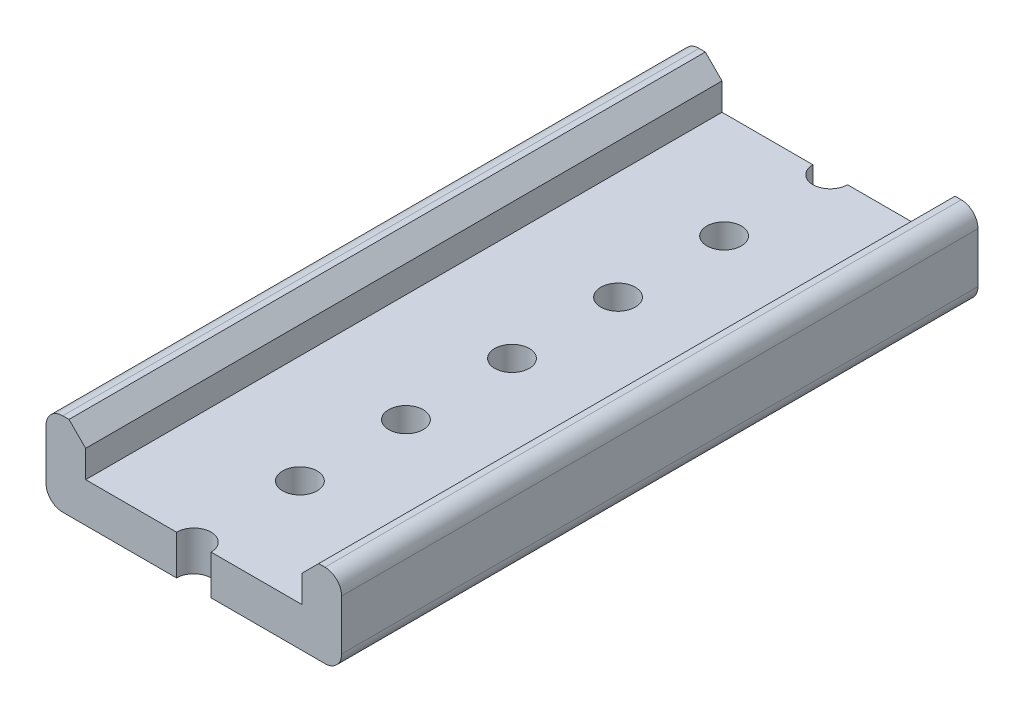
ISO-10303-21;
HEADER;
FILE_DESCRIPTION(('STEP AP214'),'2;1');
FILE_NAME('part.step','',(''),(''),'','','');
FILE_SCHEMA(('AUTOMOTIVE_DESIGN { 1 0 10303 214 1 1 1 1 }'));
ENDSEC;
DATA;
#1=APPLICATION_CONTEXT('core data for automotive mechanical design processes');
#2=APPLICATION_PROTOCOL_DEFINITION('international standard','automotive_design',2000,#1);
#3=PRODUCT_CONTEXT('',#1,'mechanical');
#4=PRODUCT('Part','Part','',(#3));
#5=PRODUCT_RELATED_PRODUCT_CATEGORY('part','',(#4));
#6=PRODUCT_DEFINITION_FORMATION('','',#4);
#7=PRODUCT_DEFINITION_CONTEXT('part definition',#1,'design');
#8=PRODUCT_DEFINITION('design','',#6,#7);
#9=PRODUCT_DEFINITION_SHAPE('','',#8);
#10=(LENGTH_UNIT() NAMED_UNIT(*) SI_UNIT(.MILLI.,.METRE.));
#11=(NAMED_UNIT(*) PLANE_ANGLE_UNIT() SI_UNIT($,.RADIAN.));
#12=(NAMED_UNIT(*) SI_UNIT($,.STERADIAN.) SOLID_ANGLE_UNIT());
#13=UNCERTAINTY_MEASURE_WITH_UNIT(LENGTH_MEASURE(1.E-05),#10,'distance_accuracy_value','');
#14=(GEOMETRIC_REPRESENTATION_CONTEXT(3) GLOBAL_UNCERTAINTY_ASSIGNED_CONTEXT((#13)) GLOBAL_UNIT_ASSIGNED_CONTEXT((#10,
#11,#12)) REPRESENTATION_CONTEXT('',''));
#15=CARTESIAN_POINT('',(0.,0.,0.));
#16=DIRECTION('',(0.,0.,1.));
#17=DIRECTION('',(1.,0.,0.));
#18=AXIS2_PLACEMENT_3D('',#15,#16,#17);
#19=CARTESIAN_POINT('',(0.,0.,38.1));
#20=DIRECTION('',(0.,0.,-1.));
#21=DIRECTION('',(-1.,0.,0.));
#22=AXIS2_PLACEMENT_3D('',#19,#20,#21);
#23=PLANE('',#22);
#24=DIRECTION('',(0.,-1.,0.));
#25=VECTOR('',#24,1.);
#26=CARTESIAN_POINT('',(-17.7,-7.7,38.1));
#27=LINE('',#26,#25);
#28=CARTESIAN_POINT('',(-17.7,-9.7,38.1));
#29=VERTEX_POINT('',#28);
#30=CARTESIAN_POINT('',(-17.7,-15.7,38.1));
#31=VERTEX_POINT('',#30);
#32=EDGE_CURVE('E202',#29,#31,#27,.T.);
#33=ORIENTED_EDGE('',*,*,#32,.T.);
#34=CARTESIAN_POINT('',(-15.7,-15.7,38.1));
#35=DIRECTION('',(0.,0.,-1.));
#36=DIRECTION('',(-1.,0.,0.));
#37=AXIS2_PLACEMENT_3D('',#34,#35,#36);
#38=CIRCLE('',#37,2.);
#39=CARTESIAN_POINT('',(-15.7,-17.7,38.1));
#40=VERTEX_POINT('',#39);
#41=EDGE_CURVE('E291',#31,#40,#38,.F.);
#42=ORIENTED_EDGE('',*,*,#41,.T.);
#43=DIRECTION('',(1.,0.,0.));
#44=VECTOR('',#43,1.);
#45=CARTESIAN_POINT('',(-17.7,-17.7,38.1));
#46=LINE('',#45,#44);
#47=CARTESIAN_POINT('',(-2.06999999999934,-17.7,38.1));
#48=VERTEX_POINT('',#47);
#49=EDGE_CURVE('E295',#40,#48,#46,.T.);
#50=ORIENTED_EDGE('',*,*,#49,.T.);
#51=DIRECTION('',(0.,1.,0.));
#52=VECTOR('',#51,1.);
#53=CARTESIAN_POINT('',(-2.06999999999934,-17.7,38.1));
#54=LINE('',#53,#52);
#55=CARTESIAN_POINT('',(-2.06999999999934,-12.95,38.1));
#56=VERTEX_POINT('',#55);
#57=EDGE_CURVE('E230',#48,#56,#54,.T.);
#58=ORIENTED_EDGE('',*,*,#57,.T.);
#59=DIRECTION('',(-1.,0.,0.));
#60=VECTOR('',#59,1.);
#61=CARTESIAN_POINT('',(-12.95,-12.95,38.1));
#62=LINE('',#61,#60);
#63=CARTESIAN_POINT('',(-12.95,-12.95,38.1));
#64=VERTEX_POINT('',#63);
#65=EDGE_CURVE('E332',#56,#64,#62,.T.);
#66=ORIENTED_EDGE('',*,*,#65,.T.);
#67=DIRECTION('',(0.,1.,0.));
#68=VECTOR('',#67,1.);
#69=CARTESIAN_POINT('',(-12.95,-7.7,38.1));
#70=LINE('',#69,#68);
#71=CARTESIAN_POINT('',(-12.95,-9.7,38.1));
#72=VERTEX_POINT('',#71);
#73=EDGE_CURVE('E327',#64,#72,#70,.T.);
#74=ORIENTED_EDGE('',*,*,#73,.T.);
#75=DIRECTION('',(0.707106781186545,-0.70710678118655,0.));
#76=VECTOR('',#75,1.);
#77=CARTESIAN_POINT('',(-14.95,-7.7,38.1));
#78=LINE('',#77,#76);
#79=CARTESIAN_POINT('',(-14.95,-7.7,38.1));
#80=VERTEX_POINT('',#79);
#81=EDGE_CURVE('E263',#72,#80,#78,.F.);
#82=ORIENTED_EDGE('',*,*,#81,.T.);
#83=DIRECTION('',(-1.,0.,0.));
#84=VECTOR('',#83,1.);
#85=CARTESIAN_POINT('',(-17.7,-7.7,38.1));
#86=LINE('',#85,#84);
#87=CARTESIAN_POINT('',(-15.7,-7.7,38.1));
#88=VERTEX_POINT('',#87);
#89=EDGE_CURVE('E315',#80,#88,#86,.T.);
#90=ORIENTED_EDGE('',*,*,#89,.T.);
#91=CARTESIAN_POINT('',(-15.7,-9.7,38.1));
#92=DIRECTION('',(0.,0.,-1.));
#93=DIRECTION('',(-1.,0.,0.));
#94=AXIS2_PLACEMENT_3D('',#91,#92,#93);
#95=CIRCLE('',#94,2.);
#96=EDGE_CURVE('E289',#88,#29,#95,.F.);
#97=ORIENTED_EDGE('',*,*,#96,.T.);
#98=EDGE_LOOP('',(#33,#42,#50,#58,#66,#74,#82,#90,#97));
#99=FACE_BOUND('',#98,.T.);
#100=ADVANCED_FACE('F39',(#99),#23,.F.);
#101=CARTESIAN_POINT('',(0.,0.,-38.1));
#102=DIRECTION('',(0.,0.,-1.));
#103=DIRECTION('',(-1.,0.,0.));
#104=AXIS2_PLACEMENT_3D('',#101,#102,#103);
#105=PLANE('',#104);
#106=DIRECTION('',(1.,0.,0.));
#107=VECTOR('',#106,1.);
#108=CARTESIAN_POINT('',(-17.7,-17.7,-38.1));
#109=LINE('',#108,#107);
#110=CARTESIAN_POINT('',(-15.7,-17.7,-38.1));
#111=VERTEX_POINT('',#110);
#112=CARTESIAN_POINT('',(-2.07000000000004,-17.7,-38.1));
#113=VERTEX_POINT('',#112);
#114=EDGE_CURVE('E188',#111,#113,#109,.T.);
#115=ORIENTED_EDGE('',*,*,#114,.F.);
#116=CARTESIAN_POINT('',(-15.7,-15.7,-38.1));
#117=DIRECTION('',(0.,0.,-1.));
#118=DIRECTION('',(-1.,0.,0.));
#119=AXIS2_PLACEMENT_3D('',#116,#117,#118);
#120=CIRCLE('',#119,2.);
#121=CARTESIAN_POINT('',(-17.7,-15.7,-38.1));
#122=VERTEX_POINT('',#121);
#123=EDGE_CURVE('E283',#111,#122,#120,.T.);
#124=ORIENTED_EDGE('',*,*,#123,.T.);
#125=DIRECTION('',(0.,-1.,0.));
#126=VECTOR('',#125,1.);
#127=CARTESIAN_POINT('',(-17.7,-7.7,-38.1));
#128=LINE('',#127,#126);
#129=CARTESIAN_POINT('',(-17.7,-9.7,-38.1));
#130=VERTEX_POINT('',#129);
#131=EDGE_CURVE('E218',#130,#122,#128,.T.);
#132=ORIENTED_EDGE('',*,*,#131,.F.);
#133=CARTESIAN_POINT('',(-15.7,-9.7,-38.1));
#134=DIRECTION('',(0.,0.,-1.));
#135=DIRECTION('',(-1.,0.,0.));
#136=AXIS2_PLACEMENT_3D('',#133,#134,#135);
#137=CIRCLE('',#136,2.);
#138=CARTESIAN_POINT('',(-15.7,-7.7,-38.1));
#139=VERTEX_POINT('',#138);
#140=EDGE_CURVE('E281',#130,#139,#137,.T.);
#141=ORIENTED_EDGE('',*,*,#140,.T.);
#142=DIRECTION('',(-1.,0.,0.));
#143=VECTOR('',#142,1.);
#144=CARTESIAN_POINT('',(-17.7,-7.7,-38.1));
#145=LINE('',#144,#143);
#146=CARTESIAN_POINT('',(-14.95,-7.7,-38.1));
#147=VERTEX_POINT('',#146);
#148=EDGE_CURVE('E216',#147,#139,#145,.T.);
#149=ORIENTED_EDGE('',*,*,#148,.F.);
#150=DIRECTION('',(-0.707106781186545,0.70710678118655,0.));
#151=VECTOR('',#150,1.);
#152=CARTESIAN_POINT('',(-11.325,-11.325,-38.1));
#153=LINE('',#152,#151);
#154=CARTESIAN_POINT('',(-12.95,-9.7,-38.1));
#155=VERTEX_POINT('',#154);
#156=EDGE_CURVE('E259',#147,#155,#153,.F.);
#157=ORIENTED_EDGE('',*,*,#156,.T.);
#158=DIRECTION('',(0.,1.,0.));
#159=VECTOR('',#158,1.);
#160=CARTESIAN_POINT('',(-12.95,-7.7,-38.1));
#161=LINE('',#160,#159);
#162=CARTESIAN_POINT('',(-12.95,-12.95,-38.1));
#163=VERTEX_POINT('',#162);
#164=EDGE_CURVE('E213',#163,#155,#161,.T.);
#165=ORIENTED_EDGE('',*,*,#164,.F.);
#166=DIRECTION('',(-1.,0.,0.));
#167=VECTOR('',#166,1.);
#168=CARTESIAN_POINT('',(-12.95,-12.95,-38.1));
#169=LINE('',#168,#167);
#170=CARTESIAN_POINT('',(-2.07000000000004,-12.95,-38.1));
#171=VERTEX_POINT('',#170);
#172=EDGE_CURVE('E210',#171,#163,#169,.T.);
#173=ORIENTED_EDGE('',*,*,#172,.F.);
#174=DIRECTION('',(0.,1.,0.));
#175=VECTOR('',#174,1.);
#176=CARTESIAN_POINT('',(-2.07000000000004,-17.7,-38.1));
#177=LINE('',#176,#175);
#178=EDGE_CURVE('E178',#113,#171,#177,.T.);
#179=ORIENTED_EDGE('',*,*,#178,.F.);
#180=EDGE_LOOP('',(#115,#124,#132,#141,#149,#157,#165,#173,#179));
#181=FACE_BOUND('',#180,.T.);
#182=ADVANCED_FACE('F306',(#181),#105,.T.);
#183=CARTESIAN_POINT('',(-17.7,-17.7,38.1));
#184=DIRECTION('',(0.,1.,0.));
#185=DIRECTION('',(-1.,0.,0.));
#186=AXIS2_PLACEMENT_3D('',#183,#184,#185);
#187=PLANE('',#186);
#188=CARTESIAN_POINT('',(1.33982511768442E-13,-17.7,-12.7));
#189=DIRECTION('',(0.,1.,0.));
#190=DIRECTION('',(0.,0.,1.));
#191=AXIS2_PLACEMENT_3D('',#188,#189,#190);
#192=CIRCLE('',#191,2.07);
#193=CARTESIAN_POINT('',(1.33982511768442E-13,-17.7,-10.63));
#194=VERTEX_POINT('',#193);
#195=EDGE_CURVE('E337',#194,#194,#192,.T.);
#196=ORIENTED_EDGE('',*,*,#195,.T.);
#197=EDGE_LOOP('',(#196));
#198=FACE_BOUND('',#197,.T.);
#199=CARTESIAN_POINT('',(2.66230300060906E-13,-17.7,0.));
#200=DIRECTION('',(0.,1.,0.));
#201=DIRECTION('',(0.,0.,1.));
#202=AXIS2_PLACEMENT_3D('',#199,#200,#201);
#203=CIRCLE('',#202,2.07);
#204=CARTESIAN_POINT('',(2.66230300060906E-13,-17.7,2.07));
#205=VERTEX_POINT('',#204);
#206=EDGE_CURVE('E611',#205,#205,#203,.T.);
#207=ORIENTED_EDGE('',*,*,#206,.T.);
#208=EDGE_LOOP('',(#207));
#209=FACE_BOUND('',#208,.T.);
#210=CARTESIAN_POINT('',(3.98478088353371E-13,-17.7,12.7));
#211=DIRECTION('',(0.,1.,0.));
#212=DIRECTION('',(0.,0.,1.));
#213=AXIS2_PLACEMENT_3D('',#210,#211,#212);
#214=CIRCLE('',#213,2.07);
#215=CARTESIAN_POINT('',(3.98478088353371E-13,-17.7,14.77));
#216=VERTEX_POINT('',#215);
#217=EDGE_CURVE('E609',#216,#216,#214,.T.);
#218=ORIENTED_EDGE('',*,*,#217,.T.);
#219=EDGE_LOOP('',(#218));
#220=FACE_BOUND('',#219,.T.);
#221=CARTESIAN_POINT('',(5.30725876645836E-13,-17.7,25.4));
#222=DIRECTION('',(0.,1.,0.));
#223=DIRECTION('',(0.,0.,1.));
#224=AXIS2_PLACEMENT_3D('',#221,#222,#223);
#225=CIRCLE('',#224,2.07);
#226=CARTESIAN_POINT('',(5.30725876645836E-13,-17.7,27.47));
#227=VERTEX_POINT('',#226);
#228=EDGE_CURVE('E605',#227,#227,#225,.T.);
#229=ORIENTED_EDGE('',*,*,#228,.T.);
#230=EDGE_LOOP('',(#229));
#231=FACE_BOUND('',#230,.T.);
#232=CARTESIAN_POINT('',(0.,-17.7,-25.4));
#233=DIRECTION('',(0.,1.,0.));
#234=DIRECTION('',(0.,0.,1.));
#235=AXIS2_PLACEMENT_3D('',#232,#233,#234);
#236=CIRCLE('',#235,2.06999999999991);
#237=CARTESIAN_POINT('',(0.,-17.7,-23.3300000000001));
#238=VERTEX_POINT('',#237);
#239=EDGE_CURVE('E333',#238,#238,#236,.T.);
#240=ORIENTED_EDGE('',*,*,#239,.T.);
#241=EDGE_LOOP('',(#240));
#242=FACE_BOUND('',#241,.T.);
#243=CARTESIAN_POINT('',(2.06999999999996,-17.7,-38.1));
#244=VERTEX_POINT('',#243);
#245=CARTESIAN_POINT('',(15.7,-17.7,-38.1));
#246=VERTEX_POINT('',#245);
#247=EDGE_CURVE('E184',#244,#246,#109,.T.);
#248=ORIENTED_EDGE('',*,*,#247,.T.);
#249=DIRECTION('',(0.,0.,-1.));
#250=VECTOR('',#249,1.);
#251=CARTESIAN_POINT('',(15.7,-17.7,38.1));
#252=LINE('',#251,#250);
#253=CARTESIAN_POINT('',(15.7,-17.7,38.1));
#254=VERTEX_POINT('',#253);
#255=EDGE_CURVE('E275',#246,#254,#252,.F.);
#256=ORIENTED_EDGE('',*,*,#255,.T.);
#257=CARTESIAN_POINT('',(2.07000000000066,-17.7,38.1));
#258=VERTEX_POINT('',#257);
#259=EDGE_CURVE('E220',#258,#254,#46,.T.);
#260=ORIENTED_EDGE('',*,*,#259,.F.);
#261=CARTESIAN_POINT('',(6.62973664938301E-13,-17.7,38.1));
#262=DIRECTION('',(0.,1.,0.));
#263=DIRECTION('',(0.,0.,1.));
#264=AXIS2_PLACEMENT_3D('',#261,#262,#263);
#265=CIRCLE('',#264,2.07);
#266=EDGE_CURVE('E189',#258,#48,#265,.T.);
#267=ORIENTED_EDGE('',*,*,#266,.T.);
#268=ORIENTED_EDGE('',*,*,#49,.F.);
#269=DIRECTION('',(0.,0.,-1.));
#270=VECTOR('',#269,1.);
#271=CARTESIAN_POINT('',(-15.7,-17.7,38.1));
#272=LINE('',#271,#270);
#273=EDGE_CURVE('E273',#40,#111,#272,.T.);
#274=ORIENTED_EDGE('',*,*,#273,.T.);
#275=ORIENTED_EDGE('',*,*,#114,.T.);
#276=CARTESIAN_POINT('',(0.,-17.7,-38.1));
#277=DIRECTION('',(0.,1.,0.));
#278=DIRECTION('',(0.,0.,1.));
#279=AXIS2_PLACEMENT_3D('',#276,#277,#278);
#280=CIRCLE('',#279,2.07);
#281=EDGE_CURVE('E170',#113,#244,#280,.T.);
#282=ORIENTED_EDGE('',*,*,#281,.T.);
#283=EDGE_LOOP('',(#248,#256,#260,#267,#268,#274,#275,#282));
#284=FACE_BOUND('',#283,.T.);
#285=ADVANCED_FACE('F183',(#198,#209,#220,#231,#242,#284),#187,.F.);
#286=CARTESIAN_POINT('',(17.7,-7.7,38.1));
#287=DIRECTION('',(-1.,0.,0.));
#288=DIRECTION('',(0.,0.,1.));
#289=AXIS2_PLACEMENT_3D('',#286,#287,#288);
#290=PLANE('',#289);
#291=DIRECTION('',(0.,1.,0.));
#292=VECTOR('',#291,1.);
#293=CARTESIAN_POINT('',(17.7,-7.7,38.1));
#294=LINE('',#293,#292);
#295=CARTESIAN_POINT('',(17.7,-15.7,38.1));
#296=VERTEX_POINT('',#295);
#297=CARTESIAN_POINT('',(17.7,-9.7,38.1));
#298=VERTEX_POINT('',#297);
#299=EDGE_CURVE('E301',#296,#298,#294,.T.);
#300=ORIENTED_EDGE('',*,*,#299,.F.);
#301=DIRECTION('',(0.,0.,-1.));
#302=VECTOR('',#301,1.);
#303=CARTESIAN_POINT('',(17.7,-15.7,38.1));
#304=LINE('',#303,#302);
#305=CARTESIAN_POINT('',(17.7,-15.7,-38.1));
#306=VERTEX_POINT('',#305);
#307=EDGE_CURVE('E267',#296,#306,#304,.T.);
#308=ORIENTED_EDGE('',*,*,#307,.T.);
#309=DIRECTION('',(0.,1.,0.));
#310=VECTOR('',#309,1.);
#311=CARTESIAN_POINT('',(17.7,-7.7,-38.1));
#312=LINE('',#311,#310);
#313=CARTESIAN_POINT('',(17.7,-9.7,-38.1));
#314=VERTEX_POINT('',#313);
#315=EDGE_CURVE('E196',#306,#314,#312,.T.);
#316=ORIENTED_EDGE('',*,*,#315,.T.);
#317=DIRECTION('',(0.,0.,-1.));
#318=VECTOR('',#317,1.);
#319=CARTESIAN_POINT('',(17.7,-9.7,38.1));
#320=LINE('',#319,#318);
#321=EDGE_CURVE('E265',#314,#298,#320,.F.);
#322=ORIENTED_EDGE('',*,*,#321,.T.);
#323=EDGE_LOOP('',(#300,#308,#316,#322));
#324=FACE_BOUND('',#323,.T.);
#325=ADVANCED_FACE('F376',(#324),#290,.F.);
#326=CARTESIAN_POINT('',(12.95,-7.7,38.1));
#327=DIRECTION('',(0.,-1.,0.));
#328=DIRECTION('',(0.,0.,-1.));
#329=AXIS2_PLACEMENT_3D('',#326,#327,#328);
#330=PLANE('',#329);
#331=DIRECTION('',(-1.,0.,0.));
#332=VECTOR('',#331,1.);
#333=CARTESIAN_POINT('',(12.95,-7.7,38.1));
#334=LINE('',#333,#332);
#335=CARTESIAN_POINT('',(15.7,-7.7,38.1));
#336=VERTEX_POINT('',#335);
#337=CARTESIAN_POINT('',(14.95,-7.7,38.1));
#338=VERTEX_POINT('',#337);
#339=EDGE_CURVE('E343',#336,#338,#334,.T.);
#340=ORIENTED_EDGE('',*,*,#339,.F.);
#341=DIRECTION('',(0.,0.,-1.));
#342=VECTOR('',#341,1.);
#343=CARTESIAN_POINT('',(15.7,-7.7,38.1));
#344=LINE('',#343,#342);
#345=CARTESIAN_POINT('',(15.7,-7.7,-38.1));
#346=VERTEX_POINT('',#345);
#347=EDGE_CURVE('E11',#336,#346,#344,.T.);
#348=ORIENTED_EDGE('',*,*,#347,.T.);
#349=DIRECTION('',(-1.,0.,0.));
#350=VECTOR('',#349,1.);
#351=CARTESIAN_POINT('',(12.95,-7.7,-38.1));
#352=LINE('',#351,#350);
#353=CARTESIAN_POINT('',(14.95,-7.7,-38.1));
#354=VERTEX_POINT('',#353);
#355=EDGE_CURVE('E206',#346,#354,#352,.T.);
#356=ORIENTED_EDGE('',*,*,#355,.T.);
#357=DIRECTION('',(0.,0.,1.));
#358=VECTOR('',#357,1.);
#359=CARTESIAN_POINT('',(14.95,-7.7,38.1));
#360=LINE('',#359,#358);
#361=EDGE_CURVE('E251',#354,#338,#360,.T.);
#362=ORIENTED_EDGE('',*,*,#361,.T.);
#363=EDGE_LOOP('',(#340,#348,#356,#362));
#364=FACE_BOUND('',#363,.T.);
#365=ADVANCED_FACE('F369',(#364),#330,.F.);
#366=CARTESIAN_POINT('',(12.95,-7.7,38.1));
#367=DIRECTION('',(1.,0.,0.));
#368=DIRECTION('',(0.,1.,0.));
#369=AXIS2_PLACEMENT_3D('',#366,#367,#368);
#370=PLANE('',#369);
#371=DIRECTION('',(0.,-1.,0.));
#372=VECTOR('',#371,1.);
#373=CARTESIAN_POINT('',(12.95,-7.7,38.1));
#374=LINE('',#373,#372);
#375=CARTESIAN_POINT('',(12.95,-9.69999999999998,38.1));
#376=VERTEX_POINT('',#375);
#377=CARTESIAN_POINT('',(12.95,-12.95,38.1));
#378=VERTEX_POINT('',#377);
#379=EDGE_CURVE('E345',#376,#378,#374,.T.);
#380=ORIENTED_EDGE('',*,*,#379,.F.);
#381=DIRECTION('',(0.,0.,-1.));
#382=VECTOR('',#381,1.);
#383=CARTESIAN_POINT('',(12.95,-9.69999999999998,38.1));
#384=LINE('',#383,#382);
#385=CARTESIAN_POINT('',(12.95,-9.69999999999998,-38.1));
#386=VERTEX_POINT('',#385);
#387=EDGE_CURVE('E233',#376,#386,#384,.T.);
#388=ORIENTED_EDGE('',*,*,#387,.T.);
#389=DIRECTION('',(0.,-1.,0.));
#390=VECTOR('',#389,1.);
#391=CARTESIAN_POINT('',(12.95,-7.7,-38.1));
#392=LINE('',#391,#390);
#393=CARTESIAN_POINT('',(12.95,-12.95,-38.1));
#394=VERTEX_POINT('',#393);
#395=EDGE_CURVE('E208',#386,#394,#392,.T.);
#396=ORIENTED_EDGE('',*,*,#395,.T.);
#397=DIRECTION('',(0.,0.,-1.));
#398=VECTOR('',#397,1.);
#399=CARTESIAN_POINT('',(12.95,-12.95,38.1));
#400=LINE('',#399,#398);
#401=EDGE_CURVE('E179',#378,#394,#400,.T.);
#402=ORIENTED_EDGE('',*,*,#401,.F.);
#403=EDGE_LOOP('',(#380,#388,#396,#402));
#404=FACE_BOUND('',#403,.T.);
#405=ADVANCED_FACE('F361',(#404),#370,.F.);
#406=CARTESIAN_POINT('',(-12.95,-12.95,38.1));
#407=DIRECTION('',(0.,-1.,0.));
#408=DIRECTION('',(0.,0.,-1.));
#409=AXIS2_PLACEMENT_3D('',#406,#407,#408);
#410=PLANE('',#409);
#411=CARTESIAN_POINT('',(1.33982511768442E-13,-12.95,-12.7));
#412=DIRECTION('',(0.,-1.,0.));
#413=DIRECTION('',(0.,0.,-1.));
#414=AXIS2_PLACEMENT_3D('',#411,#412,#413);
#415=CIRCLE('',#414,2.07);
#416=CARTESIAN_POINT('',(1.33982511768442E-13,-12.95,-14.77));
#417=VERTEX_POINT('',#416);
#418=EDGE_CURVE('E194',#417,#417,#415,.T.);
#419=ORIENTED_EDGE('',*,*,#418,.T.);
#420=EDGE_LOOP('',(#419));
#421=FACE_BOUND('',#420,.T.);
#422=CARTESIAN_POINT('',(2.66230300060906E-13,-12.95,0.));
#423=DIRECTION('',(0.,-1.,0.));
#424=DIRECTION('',(0.,0.,-1.));
#425=AXIS2_PLACEMENT_3D('',#422,#423,#424);
#426=CIRCLE('',#425,2.07);
#427=CARTESIAN_POINT('',(2.66230300060906E-13,-12.95,-2.07));
#428=VERTEX_POINT('',#427);
#429=EDGE_CURVE('E198',#428,#428,#426,.T.);
#430=ORIENTED_EDGE('',*,*,#429,.T.);
#431=EDGE_LOOP('',(#430));
#432=FACE_BOUND('',#431,.T.);
#433=CARTESIAN_POINT('',(3.98478088353371E-13,-12.95,12.7));
#434=DIRECTION('',(0.,-1.,0.));
#435=DIRECTION('',(0.,0.,-1.));
#436=AXIS2_PLACEMENT_3D('',#433,#434,#435);
#437=CIRCLE('',#436,2.07);
#438=CARTESIAN_POINT('',(3.98478088353371E-13,-12.95,10.63));
#439=VERTEX_POINT('',#438);
#440=EDGE_CURVE('E241',#439,#439,#437,.T.);
#441=ORIENTED_EDGE('',*,*,#440,.T.);
#442=EDGE_LOOP('',(#441));
#443=FACE_BOUND('',#442,.T.);
#444=CARTESIAN_POINT('',(5.30725876645836E-13,-12.95,25.4));
#445=DIRECTION('',(0.,-1.,0.));
#446=DIRECTION('',(0.,0.,-1.));
#447=AXIS2_PLACEMENT_3D('',#444,#445,#446);
#448=CIRCLE('',#447,2.07);
#449=CARTESIAN_POINT('',(5.30725876645836E-13,-12.95,23.33));
#450=VERTEX_POINT('',#449);
#451=EDGE_CURVE('E237',#450,#450,#448,.T.);
#452=ORIENTED_EDGE('',*,*,#451,.T.);
#453=EDGE_LOOP('',(#452));
#454=FACE_BOUND('',#453,.T.);
#455=CARTESIAN_POINT('',(0.,-12.95,-25.4));
#456=DIRECTION('',(0.,-1.,0.));
#457=DIRECTION('',(0.,0.,-1.));
#458=AXIS2_PLACEMENT_3D('',#455,#456,#457);
#459=CIRCLE('',#458,2.06999999999991);
#460=CARTESIAN_POINT('',(0.,-12.95,-27.4699999999999));
#461=VERTEX_POINT('',#460);
#462=EDGE_CURVE('E234',#461,#461,#459,.T.);
#463=ORIENTED_EDGE('',*,*,#462,.T.);
#464=EDGE_LOOP('',(#463));
#465=FACE_BOUND('',#464,.T.);
#466=ORIENTED_EDGE('',*,*,#65,.F.);
#467=CARTESIAN_POINT('',(6.62973664938301E-13,-12.95,38.1));
#468=DIRECTION('',(0.,-1.,0.));
#469=DIRECTION('',(0.,0.,-1.));
#470=AXIS2_PLACEMENT_3D('',#467,#468,#469);
#471=CIRCLE('',#470,2.07);
#472=CARTESIAN_POINT('',(2.07000000000066,-12.95,38.1));
#473=VERTEX_POINT('',#472);
#474=EDGE_CURVE('E238',#56,#473,#471,.T.);
#475=ORIENTED_EDGE('',*,*,#474,.T.);
#476=EDGE_CURVE('E347',#378,#473,#62,.T.);
#477=ORIENTED_EDGE('',*,*,#476,.F.);
#478=ORIENTED_EDGE('',*,*,#401,.T.);
#479=CARTESIAN_POINT('',(2.06999999999995,-12.95,-38.1));
#480=VERTEX_POINT('',#479);
#481=EDGE_CURVE('E211',#394,#480,#169,.T.);
#482=ORIENTED_EDGE('',*,*,#481,.T.);
#483=CARTESIAN_POINT('',(0.,-12.95,-38.1));
#484=DIRECTION('',(0.,-1.,0.));
#485=DIRECTION('',(0.,0.,-1.));
#486=AXIS2_PLACEMENT_3D('',#483,#484,#485);
#487=CIRCLE('',#486,2.07);
#488=EDGE_CURVE('E173',#480,#171,#487,.T.);
#489=ORIENTED_EDGE('',*,*,#488,.T.);
#490=ORIENTED_EDGE('',*,*,#172,.T.);
#491=DIRECTION('',(0.,0.,-1.));
#492=VECTOR('',#491,1.);
#493=CARTESIAN_POINT('',(-12.95,-12.95,38.1));
#494=LINE('',#493,#492);
#495=EDGE_CURVE('E221',#64,#163,#494,.T.);
#496=ORIENTED_EDGE('',*,*,#495,.F.);
#497=EDGE_LOOP('',(#466,#475,#477,#478,#482,#489,#490,#496));
#498=FACE_BOUND('',#497,.T.);
#499=ADVANCED_FACE('F330',(#421,#432,#443,#454,#465,#498),#410,.F.);
#500=CARTESIAN_POINT('',(-12.95,-7.7,38.1));
#501=DIRECTION('',(-1.,0.,0.));
#502=DIRECTION('',(0.,-1.,0.));
#503=AXIS2_PLACEMENT_3D('',#500,#501,#502);
#504=PLANE('',#503);
#505=ORIENTED_EDGE('',*,*,#164,.T.);
#506=DIRECTION('',(0.,0.,1.));
#507=VECTOR('',#506,1.);
#508=CARTESIAN_POINT('',(-12.95,-9.7,38.1));
#509=LINE('',#508,#507);
#510=EDGE_CURVE('E261',#155,#72,#509,.T.);
#511=ORIENTED_EDGE('',*,*,#510,.T.);
#512=ORIENTED_EDGE('',*,*,#73,.F.);
#513=ORIENTED_EDGE('',*,*,#495,.T.);
#514=EDGE_LOOP('',(#505,#511,#512,#513));
#515=FACE_BOUND('',#514,.T.);
#516=ADVANCED_FACE('F323',(#515),#504,.F.);
#517=CARTESIAN_POINT('',(-17.7,-7.7,38.1));
#518=DIRECTION('',(0.,-1.,0.));
#519=DIRECTION('',(0.,0.,-1.));
#520=AXIS2_PLACEMENT_3D('',#517,#518,#519);
#521=PLANE('',#520);
#522=ORIENTED_EDGE('',*,*,#148,.T.);
#523=DIRECTION('',(0.,0.,-1.));
#524=VECTOR('',#523,1.);
#525=CARTESIAN_POINT('',(-15.7,-7.7,38.1));
#526=LINE('',#525,#524);
#527=EDGE_CURVE('E47',#139,#88,#526,.F.);
#528=ORIENTED_EDGE('',*,*,#527,.T.);
#529=ORIENTED_EDGE('',*,*,#89,.F.);
#530=DIRECTION('',(0.,0.,-1.));
#531=VECTOR('',#530,1.);
#532=CARTESIAN_POINT('',(-14.95,-7.7,38.1));
#533=LINE('',#532,#531);
#534=EDGE_CURVE('E256',#80,#147,#533,.T.);
#535=ORIENTED_EDGE('',*,*,#534,.T.);
#536=EDGE_LOOP('',(#522,#528,#529,#535));
#537=FACE_BOUND('',#536,.T.);
#538=ADVANCED_FACE('F313',(#537),#521,.F.);
#539=CARTESIAN_POINT('',(-17.7,-7.7,38.1));
#540=DIRECTION('',(1.,0.,0.));
#541=DIRECTION('',(0.,0.,-1.));
#542=AXIS2_PLACEMENT_3D('',#539,#540,#541);
#543=PLANE('',#542);
#544=ORIENTED_EDGE('',*,*,#131,.T.);
#545=DIRECTION('',(0.,0.,-1.));
#546=VECTOR('',#545,1.);
#547=CARTESIAN_POINT('',(-17.7,-15.7,38.1));
#548=LINE('',#547,#546);
#549=EDGE_CURVE('E61',#122,#31,#548,.F.);
#550=ORIENTED_EDGE('',*,*,#549,.T.);
#551=ORIENTED_EDGE('',*,*,#32,.F.);
#552=DIRECTION('',(0.,0.,-1.));
#553=VECTOR('',#552,1.);
#554=CARTESIAN_POINT('',(-17.7,-9.7,38.1));
#555=LINE('',#554,#553);
#556=EDGE_CURVE('E285',#29,#130,#555,.T.);
#557=ORIENTED_EDGE('',*,*,#556,.T.);
#558=EDGE_LOOP('',(#544,#550,#551,#557));
#559=FACE_BOUND('',#558,.T.);
#560=ADVANCED_FACE('F307',(#559),#543,.F.);
#561=ORIENTED_EDGE('',*,*,#259,.T.);
#562=CARTESIAN_POINT('',(15.7,-15.7,38.1));
#563=DIRECTION('',(0.,0.,-1.));
#564=DIRECTION('',(-1.,0.,0.));
#565=AXIS2_PLACEMENT_3D('',#562,#563,#564);
#566=CIRCLE('',#565,2.);
#567=EDGE_CURVE('E279',#254,#296,#566,.F.);
#568=ORIENTED_EDGE('',*,*,#567,.T.);
#569=ORIENTED_EDGE('',*,*,#299,.T.);
#570=CARTESIAN_POINT('',(15.7,-9.7,38.1));
#571=DIRECTION('',(0.,0.,-1.));
#572=DIRECTION('',(-1.,0.,0.));
#573=AXIS2_PLACEMENT_3D('',#570,#571,#572);
#574=CIRCLE('',#573,2.);
#575=EDGE_CURVE('E277',#298,#336,#574,.F.);
#576=ORIENTED_EDGE('',*,*,#575,.T.);
#577=ORIENTED_EDGE('',*,*,#339,.T.);
#578=DIRECTION('',(0.707106781186549,0.707106781186546,0.));
#579=VECTOR('',#578,1.);
#580=CARTESIAN_POINT('',(12.95,-9.69999999999998,38.1));
#581=LINE('',#580,#579);
#582=EDGE_CURVE('E254',#338,#376,#581,.F.);
#583=ORIENTED_EDGE('',*,*,#582,.T.);
#584=ORIENTED_EDGE('',*,*,#379,.T.);
#585=ORIENTED_EDGE('',*,*,#476,.T.);
#586=DIRECTION('',(0.,1.,0.));
#587=VECTOR('',#586,1.);
#588=CARTESIAN_POINT('',(2.07000000000066,-17.7,38.1));
#589=LINE('',#588,#587);
#590=EDGE_CURVE('E227',#473,#258,#589,.F.);
#591=ORIENTED_EDGE('',*,*,#590,.T.);
#592=EDGE_LOOP('',(#561,#568,#569,#576,#577,#583,#584,#585,#591));
#593=FACE_BOUND('',#592,.T.);
#594=ADVANCED_FACE('F355',(#593),#23,.F.);
#595=ORIENTED_EDGE('',*,*,#315,.F.);
#596=CARTESIAN_POINT('',(15.7,-15.7,-38.1));
#597=DIRECTION('',(0.,0.,-1.));
#598=DIRECTION('',(-1.,0.,0.));
#599=AXIS2_PLACEMENT_3D('',#596,#597,#598);
#600=CIRCLE('',#599,2.);
#601=EDGE_CURVE('E193',#306,#246,#600,.T.);
#602=ORIENTED_EDGE('',*,*,#601,.T.);
#603=ORIENTED_EDGE('',*,*,#247,.F.);
#604=DIRECTION('',(0.,1.,0.));
#605=VECTOR('',#604,1.);
#606=CARTESIAN_POINT('',(2.06999999999996,-17.7,-38.1));
#607=LINE('',#606,#605);
#608=EDGE_CURVE('E167',#480,#244,#607,.F.);
#609=ORIENTED_EDGE('',*,*,#608,.F.);
#610=ORIENTED_EDGE('',*,*,#481,.F.);
#611=ORIENTED_EDGE('',*,*,#395,.F.);
#612=DIRECTION('',(-0.707106781186549,-0.707106781186546,0.));
#613=VECTOR('',#612,1.);
#614=CARTESIAN_POINT('',(11.325,-11.325,-38.1));
#615=LINE('',#614,#613);
#616=EDGE_CURVE('E248',#386,#354,#615,.F.);
#617=ORIENTED_EDGE('',*,*,#616,.T.);
#618=ORIENTED_EDGE('',*,*,#355,.F.);
#619=CARTESIAN_POINT('',(15.7,-9.7,-38.1));
#620=DIRECTION('',(0.,0.,-1.));
#621=DIRECTION('',(-1.,0.,0.));
#622=AXIS2_PLACEMENT_3D('',#619,#620,#621);
#623=CIRCLE('',#622,2.);
#624=EDGE_CURVE('E270',#346,#314,#623,.T.);
#625=ORIENTED_EDGE('',*,*,#624,.T.);
#626=EDGE_LOOP('',(#595,#602,#603,#609,#610,#611,#617,#618,#625));
#627=FACE_BOUND('',#626,.T.);
#628=ADVANCED_FACE('F192',(#627),#105,.T.);
#629=CARTESIAN_POINT('',(0.,-17.7,-38.1));
#630=DIRECTION('',(0.,1.,0.));
#631=DIRECTION('',(0.,0.,1.));
#632=AXIS2_PLACEMENT_3D('',#629,#630,#631);
#633=CYLINDRICAL_SURFACE('',#632,2.07);
#634=ORIENTED_EDGE('',*,*,#178,.T.);
#635=ORIENTED_EDGE('',*,*,#488,.F.);
#636=ORIENTED_EDGE('',*,*,#608,.T.);
#637=ORIENTED_EDGE('',*,*,#281,.F.);
#638=EDGE_LOOP('',(#634,#635,#636,#637));
#639=FACE_BOUND('',#638,.T.);
#640=ADVANCED_FACE('F169',(#639),#633,.F.);
#641=CARTESIAN_POINT('',(6.62973664938301E-13,-17.7,38.1));
#642=DIRECTION('',(0.,1.,0.));
#643=DIRECTION('',(0.,0.,1.));
#644=AXIS2_PLACEMENT_3D('',#641,#642,#643);
#645=CYLINDRICAL_SURFACE('',#644,2.07);
#646=ORIENTED_EDGE('',*,*,#266,.F.);
#647=ORIENTED_EDGE('',*,*,#590,.F.);
#648=ORIENTED_EDGE('',*,*,#474,.F.);
#649=ORIENTED_EDGE('',*,*,#57,.F.);
#650=EDGE_LOOP('',(#646,#647,#648,#649));
#651=FACE_BOUND('',#650,.T.);
#652=ADVANCED_FACE('F351',(#651),#645,.F.);
#653=CARTESIAN_POINT('',(0.,-17.7,-25.4));
#654=DIRECTION('',(0.,1.,0.));
#655=DIRECTION('',(0.,0.,1.));
#656=AXIS2_PLACEMENT_3D('',#653,#654,#655);
#657=CYLINDRICAL_SURFACE('',#656,2.06999999999991);
#658=ORIENTED_EDGE('',*,*,#239,.F.);
#659=EDGE_LOOP('',(#658));
#660=FACE_BOUND('',#659,.T.);
#661=ORIENTED_EDGE('',*,*,#462,.F.);
#662=EDGE_LOOP('',(#661));
#663=FACE_BOUND('',#662,.T.);
#664=ADVANCED_FACE('F451',(#660,#663),#657,.F.);
#665=CARTESIAN_POINT('',(5.30725876645836E-13,-17.7,25.4));
#666=DIRECTION('',(0.,1.,0.));
#667=DIRECTION('',(0.,0.,1.));
#668=AXIS2_PLACEMENT_3D('',#665,#666,#667);
#669=CYLINDRICAL_SURFACE('',#668,2.07);
#670=ORIENTED_EDGE('',*,*,#228,.F.);
#671=EDGE_LOOP('',(#670));
#672=FACE_BOUND('',#671,.T.);
#673=ORIENTED_EDGE('',*,*,#451,.F.);
#674=EDGE_LOOP('',(#673));
#675=FACE_BOUND('',#674,.T.);
#676=ADVANCED_FACE('F448',(#672,#675),#669,.F.);
#677=CARTESIAN_POINT('',(3.98478088353371E-13,-17.7,12.7));
#678=DIRECTION('',(0.,1.,0.));
#679=DIRECTION('',(0.,0.,1.));
#680=AXIS2_PLACEMENT_3D('',#677,#678,#679);
#681=CYLINDRICAL_SURFACE('',#680,2.07);
#682=ORIENTED_EDGE('',*,*,#217,.F.);
#683=EDGE_LOOP('',(#682));
#684=FACE_BOUND('',#683,.T.);
#685=ORIENTED_EDGE('',*,*,#440,.F.);
#686=EDGE_LOOP('',(#685));
#687=FACE_BOUND('',#686,.T.);
#688=ADVANCED_FACE('F438',(#684,#687),#681,.F.);
#689=CARTESIAN_POINT('',(2.66230300060906E-13,-17.7,0.));
#690=DIRECTION('',(0.,1.,0.));
#691=DIRECTION('',(0.,0.,1.));
#692=AXIS2_PLACEMENT_3D('',#689,#690,#691);
#693=CYLINDRICAL_SURFACE('',#692,2.07);
#694=ORIENTED_EDGE('',*,*,#206,.F.);
#695=EDGE_LOOP('',(#694));
#696=FACE_BOUND('',#695,.T.);
#697=ORIENTED_EDGE('',*,*,#429,.F.);
#698=EDGE_LOOP('',(#697));
#699=FACE_BOUND('',#698,.T.);
#700=ADVANCED_FACE('F432',(#696,#699),#693,.F.);
#701=CARTESIAN_POINT('',(1.33982511768442E-13,-17.7,-12.7));
#702=DIRECTION('',(0.,1.,0.));
#703=DIRECTION('',(0.,0.,1.));
#704=AXIS2_PLACEMENT_3D('',#701,#702,#703);
#705=CYLINDRICAL_SURFACE('',#704,2.07);
#706=ORIENTED_EDGE('',*,*,#195,.F.);
#707=EDGE_LOOP('',(#706));
#708=FACE_BOUND('',#707,.T.);
#709=ORIENTED_EDGE('',*,*,#418,.F.);
#710=EDGE_LOOP('',(#709));
#711=FACE_BOUND('',#710,.T.);
#712=ADVANCED_FACE('F426',(#708,#711),#705,.F.);
#713=CARTESIAN_POINT('',(12.95,-9.69999999999998,38.1));
#714=DIRECTION('',(0.707106781186546,-0.707106781186549,0.));
#715=DIRECTION('',(0.,0.,-1.));
#716=AXIS2_PLACEMENT_3D('',#713,#714,#715);
#717=PLANE('',#716);
#718=ORIENTED_EDGE('',*,*,#582,.F.);
#719=ORIENTED_EDGE('',*,*,#361,.F.);
#720=ORIENTED_EDGE('',*,*,#616,.F.);
#721=ORIENTED_EDGE('',*,*,#387,.F.);
#722=EDGE_LOOP('',(#718,#719,#720,#721));
#723=FACE_BOUND('',#722,.T.);
#724=ADVANCED_FACE('F366',(#723),#717,.F.);
#725=CARTESIAN_POINT('',(-14.95,-7.7,38.1));
#726=DIRECTION('',(-0.70710678118655,-0.707106781186545,0.));
#727=DIRECTION('',(0.,0.,-1.));
#728=AXIS2_PLACEMENT_3D('',#725,#726,#727);
#729=PLANE('',#728);
#730=ORIENTED_EDGE('',*,*,#81,.F.);
#731=ORIENTED_EDGE('',*,*,#510,.F.);
#732=ORIENTED_EDGE('',*,*,#156,.F.);
#733=ORIENTED_EDGE('',*,*,#534,.F.);
#734=EDGE_LOOP('',(#730,#731,#732,#733));
#735=FACE_BOUND('',#734,.T.);
#736=ADVANCED_FACE('F318',(#735),#729,.F.);
#737=CARTESIAN_POINT('',(15.7,-15.7,38.1));
#738=DIRECTION('',(0.,0.,-1.));
#739=DIRECTION('',(-1.,0.,0.));
#740=AXIS2_PLACEMENT_3D('',#737,#738,#739);
#741=CYLINDRICAL_SURFACE('',#740,2.);
#742=ORIENTED_EDGE('',*,*,#567,.F.);
#743=ORIENTED_EDGE('',*,*,#255,.F.);
#744=ORIENTED_EDGE('',*,*,#601,.F.);
#745=ORIENTED_EDGE('',*,*,#307,.F.);
#746=EDGE_LOOP('',(#742,#743,#744,#745));
#747=FACE_BOUND('',#746,.T.);
#748=ADVANCED_FACE('F380',(#747),#741,.T.);
#749=CARTESIAN_POINT('',(-15.7,-15.7,38.1));
#750=DIRECTION('',(0.,0.,-1.));
#751=DIRECTION('',(-1.,0.,0.));
#752=AXIS2_PLACEMENT_3D('',#749,#750,#751);
#753=CYLINDRICAL_SURFACE('',#752,2.);
#754=ORIENTED_EDGE('',*,*,#41,.F.);
#755=ORIENTED_EDGE('',*,*,#549,.F.);
#756=ORIENTED_EDGE('',*,*,#123,.F.);
#757=ORIENTED_EDGE('',*,*,#273,.F.);
#758=EDGE_LOOP('',(#754,#755,#756,#757));
#759=FACE_BOUND('',#758,.T.);
#760=ADVANCED_FACE('F303',(#759),#753,.T.);
#761=CARTESIAN_POINT('',(-15.7,-9.7,38.1));
#762=DIRECTION('',(0.,0.,-1.));
#763=DIRECTION('',(-1.,0.,0.));
#764=AXIS2_PLACEMENT_3D('',#761,#762,#763);
#765=CYLINDRICAL_SURFACE('',#764,2.);
#766=ORIENTED_EDGE('',*,*,#96,.F.);
#767=ORIENTED_EDGE('',*,*,#527,.F.);
#768=ORIENTED_EDGE('',*,*,#140,.F.);
#769=ORIENTED_EDGE('',*,*,#556,.F.);
#770=EDGE_LOOP('',(#766,#767,#768,#769));
#771=FACE_BOUND('',#770,.T.);
#772=ADVANCED_FACE('F311',(#771),#765,.T.);
#773=CARTESIAN_POINT('',(15.7,-9.7,38.1));
#774=DIRECTION('',(0.,0.,-1.));
#775=DIRECTION('',(-1.,0.,0.));
#776=AXIS2_PLACEMENT_3D('',#773,#774,#775);
#777=CYLINDRICAL_SURFACE('',#776,2.);
#778=ORIENTED_EDGE('',*,*,#575,.F.);
#779=ORIENTED_EDGE('',*,*,#321,.F.);
#780=ORIENTED_EDGE('',*,*,#624,.F.);
#781=ORIENTED_EDGE('',*,*,#347,.F.);
#782=EDGE_LOOP('',(#778,#779,#780,#781));
#783=FACE_BOUND('',#782,.T.);
#784=ADVANCED_FACE('F41',(#783),#777,.T.);
#785=CLOSED_SHELL('',(#100,#182,#285,#325,#365,#405,#499,#516,#538,#560,#594,#628,#640,#652,
#664,#676,#688,#700,#712,#724,#736,#748,#760,#772,#784));
#786=MANIFOLD_SOLID_BREP('B2',#785);
#787=ADVANCED_BREP_SHAPE_REPRESENTATION('',(#18,#786),#14);
#788=SHAPE_DEFINITION_REPRESENTATION(#9,#787);
ENDSEC;
END-ISO-10303-21;
